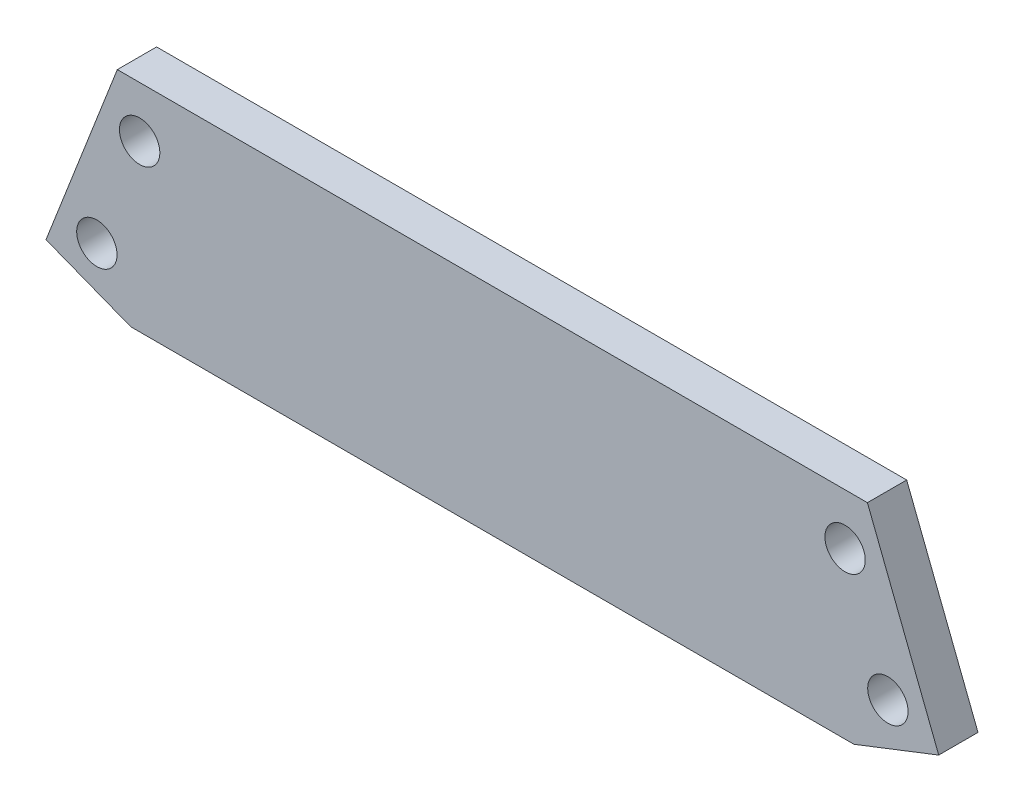
ISO-10303-21;
HEADER;
FILE_DESCRIPTION(('STEP AP214'),'2;1');
FILE_NAME('part.step','',(''),(''),'','','');
FILE_SCHEMA(('AUTOMOTIVE_DESIGN { 1 0 10303 214 1 1 1 1 }'));
ENDSEC;
DATA;
#1=APPLICATION_CONTEXT('core data for automotive mechanical design processes');
#2=APPLICATION_PROTOCOL_DEFINITION('international standard','automotive_design',2000,#1);
#3=PRODUCT_CONTEXT('',#1,'mechanical');
#4=PRODUCT('Part','Part','',(#3));
#5=PRODUCT_RELATED_PRODUCT_CATEGORY('part','',(#4));
#6=PRODUCT_DEFINITION_FORMATION('','',#4);
#7=PRODUCT_DEFINITION_CONTEXT('part definition',#1,'design');
#8=PRODUCT_DEFINITION('design','',#6,#7);
#9=PRODUCT_DEFINITION_SHAPE('','',#8);
#10=(LENGTH_UNIT() NAMED_UNIT(*) SI_UNIT(.MILLI.,.METRE.));
#11=(NAMED_UNIT(*) PLANE_ANGLE_UNIT() SI_UNIT($,.RADIAN.));
#12=(NAMED_UNIT(*) SI_UNIT($,.STERADIAN.) SOLID_ANGLE_UNIT());
#13=UNCERTAINTY_MEASURE_WITH_UNIT(LENGTH_MEASURE(1.E-05),#10,'distance_accuracy_value','');
#14=(GEOMETRIC_REPRESENTATION_CONTEXT(3) GLOBAL_UNCERTAINTY_ASSIGNED_CONTEXT((#13)) GLOBAL_UNIT_ASSIGNED_CONTEXT((#10,
#11,#12)) REPRESENTATION_CONTEXT('',''));
#15=CARTESIAN_POINT('',(0.,0.,0.));
#16=DIRECTION('',(0.,0.,1.));
#17=DIRECTION('',(1.,0.,0.));
#18=AXIS2_PLACEMENT_3D('',#15,#16,#17);
#19=CARTESIAN_POINT('',(0.,0.,-146.84375));
#20=DIRECTION('',(0.,0.,-1.));
#21=DIRECTION('',(-1.,0.,0.));
#22=AXIS2_PLACEMENT_3D('',#19,#20,#21);
#23=PLANE('',#22);
#24=CARTESIAN_POINT('',(-57.0329933903907,1075.8660329262,-146.84375));
#25=DIRECTION('',(0.,0.,-1.));
#26=DIRECTION('',(-1.,0.,0.));
#27=AXIS2_PLACEMENT_3D('',#24,#25,#26);
#28=CIRCLE('',#27,3.26390000000007);
#29=CARTESIAN_POINT('',(-60.2968933903908,1075.8660329262,-146.84375));
#30=VERTEX_POINT('',#29);
#31=EDGE_CURVE('E195',#30,#30,#28,.T.);
#32=ORIENTED_EDGE('',*,*,#31,.F.);
#33=EDGE_LOOP('',(#32));
#34=FACE_BOUND('',#33,.T.);
#35=CARTESIAN_POINT('',(57.0329933903907,1075.8660329262,-146.84375));
#36=DIRECTION('',(0.,0.,-1.));
#37=DIRECTION('',(-1.,0.,0.));
#38=AXIS2_PLACEMENT_3D('',#35,#36,#37);
#39=CIRCLE('',#38,3.26390000000007);
#40=CARTESIAN_POINT('',(53.7690933903906,1075.8660329262,-146.84375));
#41=VERTEX_POINT('',#40);
#42=EDGE_CURVE('E128',#41,#41,#39,.T.);
#43=ORIENTED_EDGE('',*,*,#42,.F.);
#44=EDGE_LOOP('',(#43));
#45=FACE_BOUND('',#44,.T.);
#46=DIRECTION('',(0.363182667764729,-0.931717956162322,0.));
#47=VECTOR('',#46,1.);
#48=CARTESIAN_POINT('',(72.1742421732454,1054.50660677998,-146.84375));
#49=LINE('',#48,#47);
#50=CARTESIAN_POINT('',(60.6431924717154,1084.08865188814,-146.84375));
#51=VERTEX_POINT('',#50);
#52=CARTESIAN_POINT('',(72.1742421732454,1054.50660677998,-146.84375));
#53=VERTEX_POINT('',#52);
#54=EDGE_CURVE('E135',#51,#53,#49,.T.);
#55=ORIENTED_EDGE('',*,*,#54,.T.);
#56=DIRECTION('',(-0.93171795616232,-0.363182667764733,0.));
#57=VECTOR('',#56,1.);
#58=CARTESIAN_POINT('',(58.4672912266659,1049.16365188814,-146.84375));
#59=LINE('',#58,#57);
#60=CARTESIAN_POINT('',(58.4672912266659,1049.16365188814,-146.84375));
#61=VERTEX_POINT('',#60);
#62=EDGE_CURVE('E93',#53,#61,#59,.T.);
#63=ORIENTED_EDGE('',*,*,#62,.T.);
#64=DIRECTION('',(-1.,0.,0.));
#65=VECTOR('',#64,1.);
#66=CARTESIAN_POINT('',(-58.4672912266661,1049.16365188814,-146.84375));
#67=LINE('',#66,#65);
#68=CARTESIAN_POINT('',(-58.4672912266661,1049.16365188814,-146.84375));
#69=VERTEX_POINT('',#68);
#70=EDGE_CURVE('E106',#61,#69,#67,.T.);
#71=ORIENTED_EDGE('',*,*,#70,.T.);
#72=DIRECTION('',(-0.931717956162321,0.363182667764732,0.));
#73=VECTOR('',#72,1.);
#74=CARTESIAN_POINT('',(-72.1742421732456,1054.50660677998,-146.84375));
#75=LINE('',#74,#73);
#76=CARTESIAN_POINT('',(-72.1742421732456,1054.50660677998,-146.84375));
#77=VERTEX_POINT('',#76);
#78=EDGE_CURVE('E100',#69,#77,#75,.T.);
#79=ORIENTED_EDGE('',*,*,#78,.T.);
#80=DIRECTION('',(0.363182667764735,0.931717956162319,0.));
#81=VECTOR('',#80,1.);
#82=CARTESIAN_POINT('',(-60.6431924717154,1084.08865188814,-146.84375));
#83=LINE('',#82,#81);
#84=CARTESIAN_POINT('',(-60.6431924717154,1084.08865188814,-146.84375));
#85=VERTEX_POINT('',#84);
#86=EDGE_CURVE('E104',#77,#85,#83,.T.);
#87=ORIENTED_EDGE('',*,*,#86,.T.);
#88=DIRECTION('',(1.,0.,0.));
#89=VECTOR('',#88,1.);
#90=CARTESIAN_POINT('',(60.6431924717154,1084.08865188814,-146.84375));
#91=LINE('',#90,#89);
#92=EDGE_CURVE('E56',#85,#51,#91,.T.);
#93=ORIENTED_EDGE('',*,*,#92,.T.);
#94=EDGE_LOOP('',(#55,#63,#71,#79,#87,#93));
#95=FACE_BOUND('',#94,.T.);
#96=CARTESIAN_POINT('',(63.9516232113088,1058.11680586131,-146.84375));
#97=DIRECTION('',(0.,0.,-1.));
#98=DIRECTION('',(-1.,0.,0.));
#99=AXIS2_PLACEMENT_3D('',#96,#97,#98);
#100=CIRCLE('',#99,3.26390000000007);
#101=CARTESIAN_POINT('',(60.6877232113088,1058.11680586131,-146.84375));
#102=VERTEX_POINT('',#101);
#103=EDGE_CURVE('E201',#102,#102,#100,.T.);
#104=ORIENTED_EDGE('',*,*,#103,.F.);
#105=EDGE_LOOP('',(#104));
#106=FACE_BOUND('',#105,.T.);
#107=CARTESIAN_POINT('',(-63.9516232113088,1058.11680586131,-146.84375));
#108=DIRECTION('',(0.,0.,-1.));
#109=DIRECTION('',(-1.,0.,0.));
#110=AXIS2_PLACEMENT_3D('',#107,#108,#109);
#111=CIRCLE('',#110,3.26390000000007);
#112=CARTESIAN_POINT('',(-67.2155232113089,1058.11680586131,-146.84375));
#113=VERTEX_POINT('',#112);
#114=EDGE_CURVE('E186',#113,#113,#111,.T.);
#115=ORIENTED_EDGE('',*,*,#114,.F.);
#116=EDGE_LOOP('',(#115));
#117=FACE_BOUND('',#116,.T.);
#118=ADVANCED_FACE('F39',(#34,#45,#95,#106,#117),#23,.T.);
#119=CARTESIAN_POINT('',(0.,0.,-140.49375));
#120=DIRECTION('',(0.,0.,-1.));
#121=DIRECTION('',(-1.,0.,0.));
#122=AXIS2_PLACEMENT_3D('',#119,#120,#121);
#123=PLANE('',#122);
#124=DIRECTION('',(0.363182667764729,-0.931717956162322,0.));
#125=VECTOR('',#124,1.);
#126=CARTESIAN_POINT('',(72.1742421732454,1054.50660677998,-140.49375));
#127=LINE('',#126,#125);
#128=CARTESIAN_POINT('',(60.6431924717154,1084.08865188814,-140.49375));
#129=VERTEX_POINT('',#128);
#130=CARTESIAN_POINT('',(72.1742421732454,1054.50660677998,-140.49375));
#131=VERTEX_POINT('',#130);
#132=EDGE_CURVE('E124',#129,#131,#127,.T.);
#133=ORIENTED_EDGE('',*,*,#132,.F.);
#134=DIRECTION('',(1.,0.,0.));
#135=VECTOR('',#134,1.);
#136=CARTESIAN_POINT('',(60.6431924717154,1084.08865188814,-140.49375));
#137=LINE('',#136,#135);
#138=CARTESIAN_POINT('',(-60.6431924717154,1084.08865188814,-140.49375));
#139=VERTEX_POINT('',#138);
#140=EDGE_CURVE('E85',#139,#129,#137,.T.);
#141=ORIENTED_EDGE('',*,*,#140,.F.);
#142=DIRECTION('',(0.363182667764735,0.931717956162319,0.));
#143=VECTOR('',#142,1.);
#144=CARTESIAN_POINT('',(-60.6431924717154,1084.08865188814,-140.49375));
#145=LINE('',#144,#143);
#146=CARTESIAN_POINT('',(-72.1742421732456,1054.50660677998,-140.49375));
#147=VERTEX_POINT('',#146);
#148=EDGE_CURVE('E79',#147,#139,#145,.T.);
#149=ORIENTED_EDGE('',*,*,#148,.F.);
#150=DIRECTION('',(-0.931717956162321,0.363182667764732,0.));
#151=VECTOR('',#150,1.);
#152=CARTESIAN_POINT('',(-72.1742421732456,1054.50660677998,-140.49375));
#153=LINE('',#152,#151);
#154=CARTESIAN_POINT('',(-58.4672912266661,1049.16365188814,-140.49375));
#155=VERTEX_POINT('',#154);
#156=EDGE_CURVE('E114',#155,#147,#153,.T.);
#157=ORIENTED_EDGE('',*,*,#156,.F.);
#158=DIRECTION('',(-1.,0.,0.));
#159=VECTOR('',#158,1.);
#160=CARTESIAN_POINT('',(-58.4672912266661,1049.16365188814,-140.49375));
#161=LINE('',#160,#159);
#162=CARTESIAN_POINT('',(58.4672912266659,1049.16365188814,-140.49375));
#163=VERTEX_POINT('',#162);
#164=EDGE_CURVE('E130',#163,#155,#161,.T.);
#165=ORIENTED_EDGE('',*,*,#164,.F.);
#166=DIRECTION('',(-0.93171795616232,-0.363182667764733,0.));
#167=VECTOR('',#166,1.);
#168=CARTESIAN_POINT('',(58.4672912266659,1049.16365188814,-140.49375));
#169=LINE('',#168,#167);
#170=EDGE_CURVE('E127',#131,#163,#169,.T.);
#171=ORIENTED_EDGE('',*,*,#170,.F.);
#172=EDGE_LOOP('',(#133,#141,#149,#157,#165,#171));
#173=FACE_BOUND('',#172,.T.);
#174=CARTESIAN_POINT('',(57.0329933903907,1075.8660329262,-140.49375));
#175=DIRECTION('',(0.,0.,-1.));
#176=DIRECTION('',(-1.,0.,0.));
#177=AXIS2_PLACEMENT_3D('',#174,#175,#176);
#178=CIRCLE('',#177,3.26390000000007);
#179=CARTESIAN_POINT('',(53.7690933903906,1075.8660329262,-140.49375));
#180=VERTEX_POINT('',#179);
#181=EDGE_CURVE('E204',#180,#180,#178,.T.);
#182=ORIENTED_EDGE('',*,*,#181,.T.);
#183=EDGE_LOOP('',(#182));
#184=FACE_BOUND('',#183,.T.);
#185=CARTESIAN_POINT('',(63.9516232113088,1058.11680586131,-140.49375));
#186=DIRECTION('',(0.,0.,-1.));
#187=DIRECTION('',(-1.,0.,0.));
#188=AXIS2_PLACEMENT_3D('',#185,#186,#187);
#189=CIRCLE('',#188,3.26390000000007);
#190=CARTESIAN_POINT('',(60.6877232113088,1058.11680586131,-140.49375));
#191=VERTEX_POINT('',#190);
#192=EDGE_CURVE('E198',#191,#191,#189,.T.);
#193=ORIENTED_EDGE('',*,*,#192,.T.);
#194=EDGE_LOOP('',(#193));
#195=FACE_BOUND('',#194,.T.);
#196=CARTESIAN_POINT('',(-57.0329933903907,1075.8660329262,-140.49375));
#197=DIRECTION('',(0.,0.,-1.));
#198=DIRECTION('',(-1.,0.,0.));
#199=AXIS2_PLACEMENT_3D('',#196,#197,#198);
#200=CIRCLE('',#199,3.26390000000007);
#201=CARTESIAN_POINT('',(-60.2968933903908,1075.8660329262,-140.49375));
#202=VERTEX_POINT('',#201);
#203=EDGE_CURVE('E192',#202,#202,#200,.T.);
#204=ORIENTED_EDGE('',*,*,#203,.T.);
#205=EDGE_LOOP('',(#204));
#206=FACE_BOUND('',#205,.T.);
#207=CARTESIAN_POINT('',(-63.9516232113088,1058.11680586131,-140.49375));
#208=DIRECTION('',(0.,0.,-1.));
#209=DIRECTION('',(-1.,0.,0.));
#210=AXIS2_PLACEMENT_3D('',#207,#208,#209);
#211=CIRCLE('',#210,3.26390000000007);
#212=CARTESIAN_POINT('',(-67.2155232113089,1058.11680586131,-140.49375));
#213=VERTEX_POINT('',#212);
#214=EDGE_CURVE('E189',#213,#213,#211,.T.);
#215=ORIENTED_EDGE('',*,*,#214,.T.);
#216=EDGE_LOOP('',(#215));
#217=FACE_BOUND('',#216,.T.);
#218=ADVANCED_FACE('F144',(#173,#184,#195,#206,#217),#123,.F.);
#219=CARTESIAN_POINT('',(72.1742421732454,1054.50660677998,-146.84375));
#220=DIRECTION('',(-0.931717956162322,-0.363182667764729,0.));
#221=DIRECTION('',(0.363182667764729,-0.931717956162322,0.));
#222=AXIS2_PLACEMENT_3D('',#219,#220,#221);
#223=PLANE('',#222);
#224=ORIENTED_EDGE('',*,*,#132,.T.);
#225=DIRECTION('',(0.,0.,1.));
#226=VECTOR('',#225,1.);
#227=CARTESIAN_POINT('',(72.1742421732454,1054.50660677998,-146.84375));
#228=LINE('',#227,#226);
#229=EDGE_CURVE('E11',#53,#131,#228,.T.);
#230=ORIENTED_EDGE('',*,*,#229,.F.);
#231=ORIENTED_EDGE('',*,*,#54,.F.);
#232=DIRECTION('',(0.,0.,1.));
#233=VECTOR('',#232,1.);
#234=CARTESIAN_POINT('',(60.6431924717154,1084.08865188814,-146.84375));
#235=LINE('',#234,#233);
#236=EDGE_CURVE('E120',#51,#129,#235,.T.);
#237=ORIENTED_EDGE('',*,*,#236,.T.);
#238=EDGE_LOOP('',(#224,#230,#231,#237));
#239=FACE_BOUND('',#238,.T.);
#240=ADVANCED_FACE('F41',(#239),#223,.F.);
#241=CARTESIAN_POINT('',(58.4672912266659,1049.16365188814,-146.84375));
#242=DIRECTION('',(-0.363182667764733,0.93171795616232,0.));
#243=DIRECTION('',(-0.93171795616232,-0.363182667764733,0.));
#244=AXIS2_PLACEMENT_3D('',#241,#242,#243);
#245=PLANE('',#244);
#246=ORIENTED_EDGE('',*,*,#170,.T.);
#247=DIRECTION('',(0.,0.,1.));
#248=VECTOR('',#247,1.);
#249=CARTESIAN_POINT('',(58.4672912266659,1049.16365188814,-146.84375));
#250=LINE('',#249,#248);
#251=EDGE_CURVE('E48',#61,#163,#250,.T.);
#252=ORIENTED_EDGE('',*,*,#251,.F.);
#253=ORIENTED_EDGE('',*,*,#62,.F.);
#254=ORIENTED_EDGE('',*,*,#229,.T.);
#255=EDGE_LOOP('',(#246,#252,#253,#254));
#256=FACE_BOUND('',#255,.T.);
#257=ADVANCED_FACE('F266',(#256),#245,.F.);
#258=CARTESIAN_POINT('',(-58.4672912266661,1049.16365188814,-146.84375));
#259=DIRECTION('',(0.,1.,0.));
#260=DIRECTION('',(0.,0.,1.));
#261=AXIS2_PLACEMENT_3D('',#258,#259,#260);
#262=PLANE('',#261);
#263=ORIENTED_EDGE('',*,*,#164,.T.);
#264=DIRECTION('',(0.,0.,1.));
#265=VECTOR('',#264,1.);
#266=CARTESIAN_POINT('',(-58.4672912266661,1049.16365188814,-146.84375));
#267=LINE('',#266,#265);
#268=EDGE_CURVE('E115',#69,#155,#267,.T.);
#269=ORIENTED_EDGE('',*,*,#268,.F.);
#270=ORIENTED_EDGE('',*,*,#70,.F.);
#271=ORIENTED_EDGE('',*,*,#251,.T.);
#272=EDGE_LOOP('',(#263,#269,#270,#271));
#273=FACE_BOUND('',#272,.T.);
#274=ADVANCED_FACE('F141',(#273),#262,.F.);
#275=CARTESIAN_POINT('',(-72.1742421732456,1054.50660677998,-146.84375));
#276=DIRECTION('',(0.363182667764732,0.931717956162321,0.));
#277=DIRECTION('',(-0.931717956162321,0.363182667764732,0.));
#278=AXIS2_PLACEMENT_3D('',#275,#276,#277);
#279=PLANE('',#278);
#280=ORIENTED_EDGE('',*,*,#156,.T.);
#281=DIRECTION('',(0.,0.,1.));
#282=VECTOR('',#281,1.);
#283=CARTESIAN_POINT('',(-72.1742421732456,1054.50660677998,-146.84375));
#284=LINE('',#283,#282);
#285=EDGE_CURVE('E111',#77,#147,#284,.T.);
#286=ORIENTED_EDGE('',*,*,#285,.F.);
#287=ORIENTED_EDGE('',*,*,#78,.F.);
#288=ORIENTED_EDGE('',*,*,#268,.T.);
#289=EDGE_LOOP('',(#280,#286,#287,#288));
#290=FACE_BOUND('',#289,.T.);
#291=ADVANCED_FACE('F112',(#290),#279,.F.);
#292=CARTESIAN_POINT('',(-60.6431924717154,1084.08865188814,-146.84375));
#293=DIRECTION('',(0.931717956162319,-0.363182667764735,0.));
#294=DIRECTION('',(0.363182667764735,0.93171795616232,0.));
#295=AXIS2_PLACEMENT_3D('',#292,#293,#294);
#296=PLANE('',#295);
#297=ORIENTED_EDGE('',*,*,#148,.T.);
#298=DIRECTION('',(0.,0.,1.));
#299=VECTOR('',#298,1.);
#300=CARTESIAN_POINT('',(-60.6431924717154,1084.08865188814,-146.84375));
#301=LINE('',#300,#299);
#302=EDGE_CURVE('E116',#85,#139,#301,.T.);
#303=ORIENTED_EDGE('',*,*,#302,.F.);
#304=ORIENTED_EDGE('',*,*,#86,.F.);
#305=ORIENTED_EDGE('',*,*,#285,.T.);
#306=EDGE_LOOP('',(#297,#303,#304,#305));
#307=FACE_BOUND('',#306,.T.);
#308=ADVANCED_FACE('F118',(#307),#296,.F.);
#309=CARTESIAN_POINT('',(60.6431924717154,1084.08865188814,-146.84375));
#310=DIRECTION('',(0.,-1.,0.));
#311=DIRECTION('',(0.,0.,-1.));
#312=AXIS2_PLACEMENT_3D('',#309,#310,#311);
#313=PLANE('',#312);
#314=ORIENTED_EDGE('',*,*,#140,.T.);
#315=ORIENTED_EDGE('',*,*,#236,.F.);
#316=ORIENTED_EDGE('',*,*,#92,.F.);
#317=ORIENTED_EDGE('',*,*,#302,.T.);
#318=EDGE_LOOP('',(#314,#315,#316,#317));
#319=FACE_BOUND('',#318,.T.);
#320=ADVANCED_FACE('F149',(#319),#313,.F.);
#321=CARTESIAN_POINT('',(57.0329933903907,1075.8660329262,-146.84375));
#322=DIRECTION('',(0.,0.,1.));
#323=DIRECTION('',(1.,0.,0.));
#324=AXIS2_PLACEMENT_3D('',#321,#322,#323);
#325=CYLINDRICAL_SURFACE('',#324,3.26390000000007);
#326=ORIENTED_EDGE('',*,*,#42,.T.);
#327=EDGE_LOOP('',(#326));
#328=FACE_BOUND('',#327,.T.);
#329=ORIENTED_EDGE('',*,*,#181,.F.);
#330=EDGE_LOOP('',(#329));
#331=FACE_BOUND('',#330,.T.);
#332=ADVANCED_FACE('F151',(#328,#331),#325,.F.);
#333=CARTESIAN_POINT('',(63.9516232113088,1058.11680586131,-146.84375));
#334=DIRECTION('',(0.,0.,1.));
#335=DIRECTION('',(1.,0.,0.));
#336=AXIS2_PLACEMENT_3D('',#333,#334,#335);
#337=CYLINDRICAL_SURFACE('',#336,3.26390000000007);
#338=ORIENTED_EDGE('',*,*,#103,.T.);
#339=EDGE_LOOP('',(#338));
#340=FACE_BOUND('',#339,.T.);
#341=ORIENTED_EDGE('',*,*,#192,.F.);
#342=EDGE_LOOP('',(#341));
#343=FACE_BOUND('',#342,.T.);
#344=ADVANCED_FACE('F157',(#340,#343),#337,.F.);
#345=CARTESIAN_POINT('',(-57.0329933903907,1075.8660329262,-146.84375));
#346=DIRECTION('',(0.,0.,1.));
#347=DIRECTION('',(1.,0.,0.));
#348=AXIS2_PLACEMENT_3D('',#345,#346,#347);
#349=CYLINDRICAL_SURFACE('',#348,3.26390000000007);
#350=ORIENTED_EDGE('',*,*,#31,.T.);
#351=EDGE_LOOP('',(#350));
#352=FACE_BOUND('',#351,.T.);
#353=ORIENTED_EDGE('',*,*,#203,.F.);
#354=EDGE_LOOP('',(#353));
#355=FACE_BOUND('',#354,.T.);
#356=ADVANCED_FACE('F173',(#352,#355),#349,.F.);
#357=CARTESIAN_POINT('',(-63.9516232113088,1058.11680586131,-146.84375));
#358=DIRECTION('',(0.,0.,1.));
#359=DIRECTION('',(1.,0.,0.));
#360=AXIS2_PLACEMENT_3D('',#357,#358,#359);
#361=CYLINDRICAL_SURFACE('',#360,3.26390000000007);
#362=ORIENTED_EDGE('',*,*,#114,.T.);
#363=EDGE_LOOP('',(#362));
#364=FACE_BOUND('',#363,.T.);
#365=ORIENTED_EDGE('',*,*,#214,.F.);
#366=EDGE_LOOP('',(#365));
#367=FACE_BOUND('',#366,.T.);
#368=ADVANCED_FACE('F177',(#364,#367),#361,.F.);
#369=CLOSED_SHELL('',(#118,#218,#240,#257,#274,#291,#308,#320,#332,#344,#356,#368));
#370=MANIFOLD_SOLID_BREP('B2',#369);
#371=ADVANCED_BREP_SHAPE_REPRESENTATION('',(#18,#370),#14);
#372=SHAPE_DEFINITION_REPRESENTATION(#9,#371);
ENDSEC;
END-ISO-10303-21;
